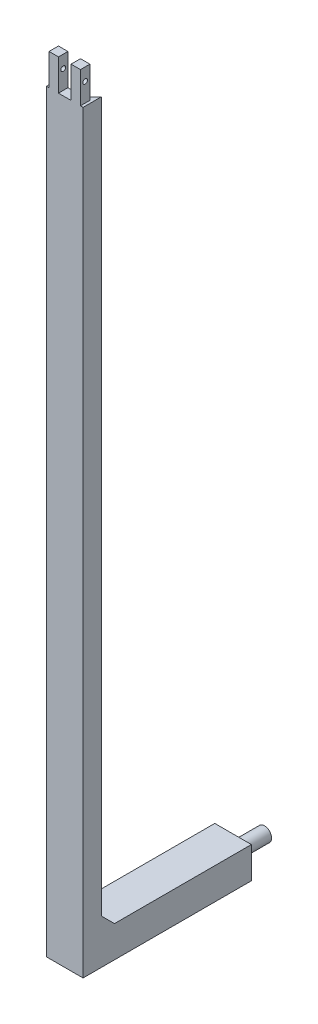
ISO-10303-21;
HEADER;
FILE_DESCRIPTION(('STEP AP214'),'2;1');
FILE_NAME('part.step','',(''),(''),'','','');
FILE_SCHEMA(('AUTOMOTIVE_DESIGN { 1 0 10303 214 1 1 1 1 }'));
ENDSEC;
DATA;
#1=APPLICATION_CONTEXT('core data for automotive mechanical design processes');
#2=APPLICATION_PROTOCOL_DEFINITION('international standard','automotive_design',2000,#1);
#3=PRODUCT_CONTEXT('',#1,'mechanical');
#4=PRODUCT('Part','Part','',(#3));
#5=PRODUCT_RELATED_PRODUCT_CATEGORY('part','',(#4));
#6=PRODUCT_DEFINITION_FORMATION('','',#4);
#7=PRODUCT_DEFINITION_CONTEXT('part definition',#1,'design');
#8=PRODUCT_DEFINITION('design','',#6,#7);
#9=PRODUCT_DEFINITION_SHAPE('','',#8);
#10=(LENGTH_UNIT() NAMED_UNIT(*) SI_UNIT(.MILLI.,.METRE.));
#11=(NAMED_UNIT(*) PLANE_ANGLE_UNIT() SI_UNIT($,.RADIAN.));
#12=(NAMED_UNIT(*) SI_UNIT($,.STERADIAN.) SOLID_ANGLE_UNIT());
#13=UNCERTAINTY_MEASURE_WITH_UNIT(LENGTH_MEASURE(1.E-05),#10,'distance_accuracy_value','');
#14=(GEOMETRIC_REPRESENTATION_CONTEXT(3) GLOBAL_UNCERTAINTY_ASSIGNED_CONTEXT((#13)) GLOBAL_UNIT_ASSIGNED_CONTEXT((#10,
#11,#12)) REPRESENTATION_CONTEXT('',''));
#15=CARTESIAN_POINT('',(0.,0.,0.));
#16=DIRECTION('',(0.,0.,1.));
#17=DIRECTION('',(1.,0.,0.));
#18=AXIS2_PLACEMENT_3D('',#15,#16,#17);
#19=CARTESIAN_POINT('',(0.,0.,0.));
#20=DIRECTION('',(0.,0.,-1.));
#21=DIRECTION('',(-1.,0.,0.));
#22=AXIS2_PLACEMENT_3D('',#19,#20,#21);
#23=PLANE('',#22);
#24=DIRECTION('',(-1.,0.,0.));
#25=VECTOR('',#24,1.);
#26=CARTESIAN_POINT('',(2.82842712474619,-223.,0.));
#27=LINE('',#26,#25);
#28=CARTESIAN_POINT('',(0.,-223.,0.));
#29=VERTEX_POINT('',#28);
#30=CARTESIAN_POINT('',(-5.99999999999997,-223.,0.));
#31=VERTEX_POINT('',#30);
#32=EDGE_CURVE('E64',#29,#31,#27,.T.);
#33=ORIENTED_EDGE('',*,*,#32,.T.);
#34=DIRECTION('',(0.,-1.,0.));
#35=VECTOR('',#34,1.);
#36=CARTESIAN_POINT('',(-6.,0.,0.));
#37=LINE('',#36,#35);
#38=CARTESIAN_POINT('',(-5.99999999999997,0.,0.));
#39=VERTEX_POINT('',#38);
#40=EDGE_CURVE('E341',#39,#31,#37,.T.);
#41=ORIENTED_EDGE('',*,*,#40,.F.);
#42=DIRECTION('',(-1.,0.,0.));
#43=VECTOR('',#42,1.);
#44=CARTESIAN_POINT('',(-7.99999999999998,0.,0.));
#45=LINE('',#44,#43);
#46=CARTESIAN_POINT('',(-7.99999999999998,0.,0.));
#47=VERTEX_POINT('',#46);
#48=EDGE_CURVE('E49',#39,#47,#45,.T.);
#49=ORIENTED_EDGE('',*,*,#48,.T.);
#50=DIRECTION('',(0.,-1.,0.));
#51=VECTOR('',#50,1.);
#52=CARTESIAN_POINT('',(-7.99999999999999,10.,0.));
#53=LINE('',#52,#51);
#54=CARTESIAN_POINT('',(-7.99999999999999,10.,0.));
#55=VERTEX_POINT('',#54);
#56=EDGE_CURVE('E265',#55,#47,#53,.T.);
#57=ORIENTED_EDGE('',*,*,#56,.F.);
#58=DIRECTION('',(-1.,0.,0.));
#59=VECTOR('',#58,1.);
#60=CARTESIAN_POINT('',(-7.99999999999999,10.,0.));
#61=LINE('',#60,#59);
#62=CARTESIAN_POINT('',(-4.99999999999999,10.,0.));
#63=VERTEX_POINT('',#62);
#64=EDGE_CURVE('E262',#63,#55,#61,.T.);
#65=ORIENTED_EDGE('',*,*,#64,.F.);
#66=DIRECTION('',(0.,-1.,0.));
#67=VECTOR('',#66,1.);
#68=CARTESIAN_POINT('',(-4.99999999999999,10.,0.));
#69=LINE('',#68,#67);
#70=CARTESIAN_POINT('',(-4.99999999999998,0.,0.));
#71=VERTEX_POINT('',#70);
#72=EDGE_CURVE('E279',#63,#71,#69,.T.);
#73=ORIENTED_EDGE('',*,*,#72,.T.);
#74=DIRECTION('',(-1.,0.,0.));
#75=VECTOR('',#74,1.);
#76=CARTESIAN_POINT('',(0.,0.,0.));
#77=LINE('',#76,#75);
#78=CARTESIAN_POINT('',(-0.999999999999984,0.,0.));
#79=VERTEX_POINT('',#78);
#80=EDGE_CURVE('E339',#79,#71,#77,.T.);
#81=ORIENTED_EDGE('',*,*,#80,.F.);
#82=DIRECTION('',(0.,-1.,0.));
#83=VECTOR('',#82,1.);
#84=CARTESIAN_POINT('',(-0.999999999999986,10.,0.));
#85=LINE('',#84,#83);
#86=CARTESIAN_POINT('',(-0.999999999999986,10.,0.));
#87=VERTEX_POINT('',#86);
#88=EDGE_CURVE('E242',#87,#79,#85,.T.);
#89=ORIENTED_EDGE('',*,*,#88,.F.);
#90=DIRECTION('',(-1.,0.,0.));
#91=VECTOR('',#90,1.);
#92=CARTESIAN_POINT('',(2.00000000000001,10.,0.));
#93=LINE('',#92,#91);
#94=CARTESIAN_POINT('',(2.00000000000001,10.,0.));
#95=VERTEX_POINT('',#94);
#96=EDGE_CURVE('E214',#95,#87,#93,.T.);
#97=ORIENTED_EDGE('',*,*,#96,.F.);
#98=DIRECTION('',(0.,-1.,0.));
#99=VECTOR('',#98,1.);
#100=CARTESIAN_POINT('',(2.00000000000001,10.,0.));
#101=LINE('',#100,#99);
#102=CARTESIAN_POINT('',(2.00000000000002,0.,0.));
#103=VERTEX_POINT('',#102);
#104=EDGE_CURVE('E246',#95,#103,#101,.T.);
#105=ORIENTED_EDGE('',*,*,#104,.T.);
#106=DIRECTION('',(-1.,0.,0.));
#107=VECTOR('',#106,1.);
#108=CARTESIAN_POINT('',(2.00000000000002,0.,0.));
#109=LINE('',#108,#107);
#110=CARTESIAN_POINT('',(0.,0.,0.));
#111=VERTEX_POINT('',#110);
#112=EDGE_CURVE('E228',#103,#111,#109,.T.);
#113=ORIENTED_EDGE('',*,*,#112,.T.);
#114=DIRECTION('',(0.,1.,0.));
#115=VECTOR('',#114,1.);
#116=CARTESIAN_POINT('',(0.,0.,0.));
#117=LINE('',#116,#115);
#118=EDGE_CURVE('E325',#29,#111,#117,.T.);
#119=ORIENTED_EDGE('',*,*,#118,.F.);
#120=EDGE_LOOP('',(#33,#41,#49,#57,#65,#73,#81,#89,#97,#105,#113,#119));
#121=FACE_BOUND('',#120,.T.);
#122=ADVANCED_FACE('F39',(#121),#23,.T.);
#123=CARTESIAN_POINT('',(0.,0.,0.));
#124=DIRECTION('',(-0.707106781186549,0.,-0.707106781186546));
#125=DIRECTION('',(-0.707106781186546,0.,0.707106781186549));
#126=AXIS2_PLACEMENT_3D('',#123,#124,#125);
#127=PLANE('',#126);
#128=DIRECTION('',(0.577350269189624,-0.577350269189627,-0.577350269189626));
#129=VECTOR('',#128,1.);
#130=CARTESIAN_POINT('',(-74.3333333333333,-148.666666666666,74.3333333333335));
#131=LINE('',#130,#129);
#132=CARTESIAN_POINT('',(2.82842712474619,-225.828427124746,-2.82842712474619));
#133=VERTEX_POINT('',#132);
#134=EDGE_CURVE('E57',#29,#133,#131,.T.);
#135=ORIENTED_EDGE('',*,*,#134,.F.);
#136=ORIENTED_EDGE('',*,*,#118,.T.);
#137=DIRECTION('',(0.707106781186546,0.,-0.707106781186549));
#138=VECTOR('',#137,1.);
#139=CARTESIAN_POINT('',(0.,0.,0.));
#140=LINE('',#139,#138);
#141=CARTESIAN_POINT('',(2.82842712474619,0.,-2.82842712474619));
#142=VERTEX_POINT('',#141);
#143=EDGE_CURVE('E310',#111,#142,#140,.T.);
#144=ORIENTED_EDGE('',*,*,#143,.T.);
#145=DIRECTION('',(0.,-1.,0.));
#146=VECTOR('',#145,1.);
#147=CARTESIAN_POINT('',(2.82842712474619,0.,-2.82842712474619));
#148=LINE('',#147,#146);
#149=EDGE_CURVE('E318',#142,#133,#148,.T.);
#150=ORIENTED_EDGE('',*,*,#149,.T.);
#151=EDGE_LOOP('',(#135,#136,#144,#150));
#152=FACE_BOUND('',#151,.T.);
#153=ADVANCED_FACE('F382',(#152),#127,.T.);
#154=CARTESIAN_POINT('',(-5.99999999999997,0.,0.));
#155=DIRECTION('',(0.707106781186549,0.,-0.707106781186546));
#156=DIRECTION('',(-0.707106781186546,0.,-0.707106781186549));
#157=AXIS2_PLACEMENT_3D('',#154,#155,#156);
#158=PLANE('',#157);
#159=DIRECTION('',(0.577350269189624,0.577350269189627,0.577350269189626));
#160=VECTOR('',#159,1.);
#161=CARTESIAN_POINT('',(68.3333333333333,-148.666666666666,74.3333333333335));
#162=LINE('',#161,#160);
#163=CARTESIAN_POINT('',(-8.82842712474615,-225.828427124746,-2.82842712474619));
#164=VERTEX_POINT('',#163);
#165=EDGE_CURVE('E386',#164,#31,#162,.T.);
#166=ORIENTED_EDGE('',*,*,#165,.F.);
#167=DIRECTION('',(0.,-1.,0.));
#168=VECTOR('',#167,1.);
#169=CARTESIAN_POINT('',(-8.82842712474615,0.,-2.8284271247462));
#170=LINE('',#169,#168);
#171=CARTESIAN_POINT('',(-8.82842712474615,0.,-2.8284271247462));
#172=VERTEX_POINT('',#171);
#173=EDGE_CURVE('E300',#172,#164,#170,.T.);
#174=ORIENTED_EDGE('',*,*,#173,.F.);
#175=DIRECTION('',(0.707106781186546,0.,0.707106781186549));
#176=VECTOR('',#175,1.);
#177=CARTESIAN_POINT('',(-5.99999999999997,0.,0.));
#178=LINE('',#177,#176);
#179=EDGE_CURVE('E296',#172,#39,#178,.T.);
#180=ORIENTED_EDGE('',*,*,#179,.T.);
#181=ORIENTED_EDGE('',*,*,#40,.T.);
#182=EDGE_LOOP('',(#166,#174,#180,#181));
#183=FACE_BOUND('',#182,.T.);
#184=ADVANCED_FACE('F372',(#183),#158,.T.);
#185=CARTESIAN_POINT('',(0.,0.,3.));
#186=DIRECTION('',(0.,-1.,0.));
#187=DIRECTION('',(1.,0.,0.));
#188=AXIS2_PLACEMENT_3D('',#185,#186,#187);
#189=PLANE('',#188);
#190=DIRECTION('',(0.,0.,-1.));
#191=VECTOR('',#190,1.);
#192=CARTESIAN_POINT('',(2.00000000000002,0.,3.));
#193=LINE('',#192,#191);
#194=CARTESIAN_POINT('',(2.00000000000002,0.,3.));
#195=VERTEX_POINT('',#194);
#196=EDGE_CURVE('E209',#195,#103,#193,.T.);
#197=ORIENTED_EDGE('',*,*,#196,.F.);
#198=DIRECTION('',(-1.,0.,0.));
#199=VECTOR('',#198,1.);
#200=CARTESIAN_POINT('',(0.,0.,3.));
#201=LINE('',#200,#199);
#202=CARTESIAN_POINT('',(2.82842712474618,0.,3.));
#203=VERTEX_POINT('',#202);
#204=EDGE_CURVE('E328',#203,#195,#201,.T.);
#205=ORIENTED_EDGE('',*,*,#204,.F.);
#206=DIRECTION('',(0.,0.,1.));
#207=VECTOR('',#206,1.);
#208=CARTESIAN_POINT('',(2.82842712474619,0.,-2.82842712474619));
#209=LINE('',#208,#207);
#210=EDGE_CURVE('E314',#142,#203,#209,.T.);
#211=ORIENTED_EDGE('',*,*,#210,.F.);
#212=ORIENTED_EDGE('',*,*,#143,.F.);
#213=ORIENTED_EDGE('',*,*,#112,.F.);
#214=EDGE_LOOP('',(#197,#205,#211,#212,#213));
#215=FACE_BOUND('',#214,.T.);
#216=ADVANCED_FACE('F381',(#215),#189,.F.);
#217=DIRECTION('',(0.,0.,1.));
#218=VECTOR('',#217,1.);
#219=CARTESIAN_POINT('',(-0.999999999999984,0.,3.));
#220=LINE('',#219,#218);
#221=CARTESIAN_POINT('',(-0.999999999999984,0.,3.));
#222=VERTEX_POINT('',#221);
#223=EDGE_CURVE('E215',#79,#222,#220,.T.);
#224=ORIENTED_EDGE('',*,*,#223,.F.);
#225=ORIENTED_EDGE('',*,*,#80,.T.);
#226=DIRECTION('',(0.,0.,-1.));
#227=VECTOR('',#226,1.);
#228=CARTESIAN_POINT('',(-4.99999999999998,0.,3.));
#229=LINE('',#228,#227);
#230=CARTESIAN_POINT('',(-4.99999999999998,0.,3.));
#231=VERTEX_POINT('',#230);
#232=EDGE_CURVE('E256',#231,#71,#229,.T.);
#233=ORIENTED_EDGE('',*,*,#232,.F.);
#234=EDGE_CURVE('E332',#222,#231,#201,.T.);
#235=ORIENTED_EDGE('',*,*,#234,.F.);
#236=EDGE_LOOP('',(#224,#225,#233,#235));
#237=FACE_BOUND('',#236,.T.);
#238=ADVANCED_FACE('F357',(#237),#189,.F.);
#239=DIRECTION('',(0.,0.,1.));
#240=VECTOR('',#239,1.);
#241=CARTESIAN_POINT('',(-7.99999999999999,0.,3.));
#242=LINE('',#241,#240);
#243=CARTESIAN_POINT('',(-7.99999999999999,0.,3.));
#244=VERTEX_POINT('',#243);
#245=EDGE_CURVE('E250',#47,#244,#242,.T.);
#246=ORIENTED_EDGE('',*,*,#245,.F.);
#247=ORIENTED_EDGE('',*,*,#48,.F.);
#248=ORIENTED_EDGE('',*,*,#179,.F.);
#249=DIRECTION('',(0.,0.,-1.));
#250=VECTOR('',#249,1.);
#251=CARTESIAN_POINT('',(-8.82842712474615,0.,-2.8284271247462));
#252=LINE('',#251,#250);
#253=CARTESIAN_POINT('',(-8.82842712474615,0.,3.));
#254=VERTEX_POINT('',#253);
#255=EDGE_CURVE('E292',#254,#172,#252,.T.);
#256=ORIENTED_EDGE('',*,*,#255,.F.);
#257=EDGE_CURVE('E333',#244,#254,#201,.T.);
#258=ORIENTED_EDGE('',*,*,#257,.F.);
#259=EDGE_LOOP('',(#246,#247,#248,#256,#258));
#260=FACE_BOUND('',#259,.T.);
#261=ADVANCED_FACE('F41',(#260),#189,.F.);
#262=CARTESIAN_POINT('',(0.,-240.,3.));
#263=DIRECTION('',(0.,1.,0.));
#264=DIRECTION('',(0.,0.,1.));
#265=AXIS2_PLACEMENT_3D('',#262,#263,#264);
#266=PLANE('',#265);
#267=DIRECTION('',(0.,0.,-1.));
#268=VECTOR('',#267,1.);
#269=CARTESIAN_POINT('',(-8.82842712474615,-240.,-2.8284271247462));
#270=LINE('',#269,#268);
#271=CARTESIAN_POINT('',(-8.82842712474615,-240.,3.));
#272=VERTEX_POINT('',#271);
#273=CARTESIAN_POINT('',(-8.82842712474615,-240.,-50.58));
#274=VERTEX_POINT('',#273);
#275=EDGE_CURVE('E291',#272,#274,#270,.T.);
#276=ORIENTED_EDGE('',*,*,#275,.T.);
#277=DIRECTION('',(-1.,0.,0.));
#278=VECTOR('',#277,1.);
#279=CARTESIAN_POINT('',(-8.82842712474615,-240.,-50.58));
#280=LINE('',#279,#278);
#281=CARTESIAN_POINT('',(2.82842712474619,-240.,-50.58));
#282=VERTEX_POINT('',#281);
#283=EDGE_CURVE('E180',#282,#274,#280,.T.);
#284=ORIENTED_EDGE('',*,*,#283,.F.);
#285=DIRECTION('',(0.,0.,1.));
#286=VECTOR('',#285,1.);
#287=CARTESIAN_POINT('',(2.82842712474619,-240.,-2.82842712474619));
#288=LINE('',#287,#286);
#289=CARTESIAN_POINT('',(2.82842712474618,-240.,3.));
#290=VERTEX_POINT('',#289);
#291=EDGE_CURVE('E307',#282,#290,#288,.T.);
#292=ORIENTED_EDGE('',*,*,#291,.T.);
#293=DIRECTION('',(1.,0.,0.));
#294=VECTOR('',#293,1.);
#295=CARTESIAN_POINT('',(0.,-240.,3.));
#296=LINE('',#295,#294);
#297=EDGE_CURVE('E275',#272,#290,#296,.T.);
#298=ORIENTED_EDGE('',*,*,#297,.F.);
#299=EDGE_LOOP('',(#276,#284,#292,#298));
#300=FACE_BOUND('',#299,.T.);
#301=ADVANCED_FACE('F405',(#300),#266,.F.);
#302=CARTESIAN_POINT('',(0.,0.,3.));
#303=DIRECTION('',(0.,0.,-1.));
#304=DIRECTION('',(-1.,0.,0.));
#305=AXIS2_PLACEMENT_3D('',#302,#303,#304);
#306=PLANE('',#305);
#307=ORIENTED_EDGE('',*,*,#297,.T.);
#308=DIRECTION('',(0.,-1.,0.));
#309=VECTOR('',#308,1.);
#310=CARTESIAN_POINT('',(2.82842712474618,0.,3.));
#311=LINE('',#310,#309);
#312=EDGE_CURVE('E321',#203,#290,#311,.T.);
#313=ORIENTED_EDGE('',*,*,#312,.F.);
#314=ORIENTED_EDGE('',*,*,#204,.T.);
#315=DIRECTION('',(0.,-1.,0.));
#316=VECTOR('',#315,1.);
#317=CARTESIAN_POINT('',(2.00000000000002,10.,3.));
#318=LINE('',#317,#316);
#319=CARTESIAN_POINT('',(2.00000000000002,10.,3.));
#320=VERTEX_POINT('',#319);
#321=EDGE_CURVE('E224',#320,#195,#318,.T.);
#322=ORIENTED_EDGE('',*,*,#321,.F.);
#323=DIRECTION('',(1.,0.,0.));
#324=VECTOR('',#323,1.);
#325=CARTESIAN_POINT('',(2.00000000000002,10.,3.));
#326=LINE('',#325,#324);
#327=CARTESIAN_POINT('',(-0.999999999999986,10.,3.));
#328=VERTEX_POINT('',#327);
#329=EDGE_CURVE('E221',#328,#320,#326,.T.);
#330=ORIENTED_EDGE('',*,*,#329,.F.);
#331=DIRECTION('',(0.,-1.,0.));
#332=VECTOR('',#331,1.);
#333=CARTESIAN_POINT('',(-0.999999999999986,10.,3.));
#334=LINE('',#333,#332);
#335=EDGE_CURVE('E238',#328,#222,#334,.T.);
#336=ORIENTED_EDGE('',*,*,#335,.T.);
#337=ORIENTED_EDGE('',*,*,#234,.T.);
#338=DIRECTION('',(0.,-1.,0.));
#339=VECTOR('',#338,1.);
#340=CARTESIAN_POINT('',(-4.99999999999999,10.,3.));
#341=LINE('',#340,#339);
#342=CARTESIAN_POINT('',(-4.99999999999999,10.,3.));
#343=VERTEX_POINT('',#342);
#344=EDGE_CURVE('E283',#343,#231,#341,.T.);
#345=ORIENTED_EDGE('',*,*,#344,.F.);
#346=DIRECTION('',(1.,0.,0.));
#347=VECTOR('',#346,1.);
#348=CARTESIAN_POINT('',(-7.99999999999999,10.,3.));
#349=LINE('',#348,#347);
#350=CARTESIAN_POINT('',(-7.99999999999999,10.,3.));
#351=VERTEX_POINT('',#350);
#352=EDGE_CURVE('E255',#351,#343,#349,.T.);
#353=ORIENTED_EDGE('',*,*,#352,.F.);
#354=DIRECTION('',(0.,-1.,0.));
#355=VECTOR('',#354,1.);
#356=CARTESIAN_POINT('',(-7.99999999999999,10.,3.));
#357=LINE('',#356,#355);
#358=EDGE_CURVE('E287',#351,#244,#357,.T.);
#359=ORIENTED_EDGE('',*,*,#358,.T.);
#360=ORIENTED_EDGE('',*,*,#257,.T.);
#361=DIRECTION('',(0.,-1.,0.));
#362=VECTOR('',#361,1.);
#363=CARTESIAN_POINT('',(-8.82842712474615,0.,3.));
#364=LINE('',#363,#362);
#365=EDGE_CURVE('E303',#254,#272,#364,.T.);
#366=ORIENTED_EDGE('',*,*,#365,.T.);
#367=EDGE_LOOP('',(#307,#313,#314,#322,#330,#336,#337,#345,#353,#359,#360,#366));
#368=FACE_BOUND('',#367,.T.);
#369=ADVANCED_FACE('F351',(#368),#306,.F.);
#370=CARTESIAN_POINT('',(2.82842712474619,0.,-2.82842712474619));
#371=DIRECTION('',(1.,0.,0.));
#372=DIRECTION('',(0.,0.,-1.));
#373=AXIS2_PLACEMENT_3D('',#370,#371,#372);
#374=PLANE('',#373);
#375=DIRECTION('',(0.,-0.707106781186548,-0.707106781186547));
#376=VECTOR('',#375,1.);
#377=CARTESIAN_POINT('',(2.82842712474619,-223.,0.));
#378=LINE('',#377,#376);
#379=CARTESIAN_POINT('',(2.82842712474619,-230.,-7.));
#380=VERTEX_POINT('',#379);
#381=EDGE_CURVE('E393',#133,#380,#378,.T.);
#382=ORIENTED_EDGE('',*,*,#381,.F.);
#383=ORIENTED_EDGE('',*,*,#149,.F.);
#384=ORIENTED_EDGE('',*,*,#210,.T.);
#385=ORIENTED_EDGE('',*,*,#312,.T.);
#386=ORIENTED_EDGE('',*,*,#291,.F.);
#387=DIRECTION('',(0.,-1.,0.));
#388=VECTOR('',#387,1.);
#389=CARTESIAN_POINT('',(2.82842712474619,-240.,-50.58));
#390=LINE('',#389,#388);
#391=CARTESIAN_POINT('',(2.82842712474619,-230.,-50.58));
#392=VERTEX_POINT('',#391);
#393=EDGE_CURVE('E173',#392,#282,#390,.T.);
#394=ORIENTED_EDGE('',*,*,#393,.F.);
#395=DIRECTION('',(0.,0.,1.));
#396=VECTOR('',#395,1.);
#397=CARTESIAN_POINT('',(2.82842712474619,-230.,-50.58));
#398=LINE('',#397,#396);
#399=EDGE_CURVE('E168',#392,#380,#398,.T.);
#400=ORIENTED_EDGE('',*,*,#399,.T.);
#401=EDGE_LOOP('',(#382,#383,#384,#385,#386,#394,#400));
#402=FACE_BOUND('',#401,.T.);
#403=ADVANCED_FACE('F377',(#402),#374,.T.);
#404=CARTESIAN_POINT('',(-8.82842712474615,0.,-2.8284271247462));
#405=DIRECTION('',(-1.,0.,0.));
#406=DIRECTION('',(0.,0.,1.));
#407=AXIS2_PLACEMENT_3D('',#404,#405,#406);
#408=PLANE('',#407);
#409=ORIENTED_EDGE('',*,*,#173,.T.);
#410=DIRECTION('',(0.,-0.707106781186548,-0.707106781186547));
#411=VECTOR('',#410,1.);
#412=CARTESIAN_POINT('',(-8.82842712474615,-223.,0.));
#413=LINE('',#412,#411);
#414=CARTESIAN_POINT('',(-8.82842712474615,-230.,-7.));
#415=VERTEX_POINT('',#414);
#416=EDGE_CURVE('E189',#164,#415,#413,.T.);
#417=ORIENTED_EDGE('',*,*,#416,.T.);
#418=DIRECTION('',(0.,0.,1.));
#419=VECTOR('',#418,1.);
#420=CARTESIAN_POINT('',(-8.82842712474615,-230.,-50.58));
#421=LINE('',#420,#419);
#422=CARTESIAN_POINT('',(-8.82842712474615,-230.,-50.58));
#423=VERTEX_POINT('',#422);
#424=EDGE_CURVE('E165',#423,#415,#421,.T.);
#425=ORIENTED_EDGE('',*,*,#424,.F.);
#426=DIRECTION('',(0.,1.,0.));
#427=VECTOR('',#426,1.);
#428=CARTESIAN_POINT('',(-8.82842712474615,-240.,-50.58));
#429=LINE('',#428,#427);
#430=EDGE_CURVE('E174',#274,#423,#429,.T.);
#431=ORIENTED_EDGE('',*,*,#430,.F.);
#432=ORIENTED_EDGE('',*,*,#275,.F.);
#433=ORIENTED_EDGE('',*,*,#365,.F.);
#434=ORIENTED_EDGE('',*,*,#255,.T.);
#435=EDGE_LOOP('',(#409,#417,#425,#431,#432,#433,#434));
#436=FACE_BOUND('',#435,.T.);
#437=ADVANCED_FACE('F187',(#436),#408,.T.);
#438=CARTESIAN_POINT('',(-7.99999999999999,10.,3.));
#439=DIRECTION('',(1.,0.,0.));
#440=DIRECTION('',(0.,0.,-1.));
#441=AXIS2_PLACEMENT_3D('',#438,#439,#440);
#442=PLANE('',#441);
#443=CARTESIAN_POINT('',(-7.99999999999999,6.,1.50000000000001));
#444=DIRECTION('',(1.,0.,0.));
#445=DIRECTION('',(0.,0.,-1.));
#446=AXIS2_PLACEMENT_3D('',#443,#444,#445);
#447=CIRCLE('',#446,0.75);
#448=CARTESIAN_POINT('',(-7.99999999999999,6.,0.750000000000006));
#449=VERTEX_POINT('',#448);
#450=EDGE_CURVE('E205',#449,#449,#447,.T.);
#451=ORIENTED_EDGE('',*,*,#450,.T.);
#452=EDGE_LOOP('',(#451));
#453=FACE_BOUND('',#452,.T.);
#454=ORIENTED_EDGE('',*,*,#245,.T.);
#455=ORIENTED_EDGE('',*,*,#358,.F.);
#456=DIRECTION('',(0.,0.,1.));
#457=VECTOR('',#456,1.);
#458=CARTESIAN_POINT('',(-7.99999999999999,10.,3.));
#459=LINE('',#458,#457);
#460=EDGE_CURVE('E251',#55,#351,#459,.T.);
#461=ORIENTED_EDGE('',*,*,#460,.F.);
#462=ORIENTED_EDGE('',*,*,#56,.T.);
#463=EDGE_LOOP('',(#454,#455,#461,#462));
#464=FACE_BOUND('',#463,.T.);
#465=ADVANCED_FACE('F368',(#453,#464),#442,.F.);
#466=CARTESIAN_POINT('',(-4.99999999999999,10.,3.));
#467=DIRECTION('',(-1.,0.,0.));
#468=DIRECTION('',(0.,-1.,0.));
#469=AXIS2_PLACEMENT_3D('',#466,#467,#468);
#470=PLANE('',#469);
#471=CARTESIAN_POINT('',(-4.99999999999998,6.,1.5));
#472=DIRECTION('',(-1.,0.,0.));
#473=DIRECTION('',(0.,-1.,0.));
#474=AXIS2_PLACEMENT_3D('',#471,#472,#473);
#475=CIRCLE('',#474,0.75);
#476=CARTESIAN_POINT('',(-4.99999999999998,5.25,1.5));
#477=VERTEX_POINT('',#476);
#478=EDGE_CURVE('E201',#477,#477,#475,.T.);
#479=ORIENTED_EDGE('',*,*,#478,.T.);
#480=EDGE_LOOP('',(#479));
#481=FACE_BOUND('',#480,.T.);
#482=ORIENTED_EDGE('',*,*,#232,.T.);
#483=ORIENTED_EDGE('',*,*,#72,.F.);
#484=DIRECTION('',(0.,0.,-1.));
#485=VECTOR('',#484,1.);
#486=CARTESIAN_POINT('',(-4.99999999999999,10.,3.));
#487=LINE('',#486,#485);
#488=EDGE_CURVE('E259',#343,#63,#487,.T.);
#489=ORIENTED_EDGE('',*,*,#488,.F.);
#490=ORIENTED_EDGE('',*,*,#344,.T.);
#491=EDGE_LOOP('',(#482,#483,#489,#490));
#492=FACE_BOUND('',#491,.T.);
#493=ADVANCED_FACE('F360',(#481,#492),#470,.F.);
#494=CARTESIAN_POINT('',(0.,10.,0.));
#495=DIRECTION('',(0.,-1.,0.));
#496=DIRECTION('',(1.,0.,0.));
#497=AXIS2_PLACEMENT_3D('',#494,#495,#496);
#498=PLANE('',#497);
#499=ORIENTED_EDGE('',*,*,#460,.T.);
#500=ORIENTED_EDGE('',*,*,#352,.T.);
#501=ORIENTED_EDGE('',*,*,#488,.T.);
#502=ORIENTED_EDGE('',*,*,#64,.T.);
#503=EDGE_LOOP('',(#499,#500,#501,#502));
#504=FACE_BOUND('',#503,.T.);
#505=ADVANCED_FACE('F363',(#504),#498,.F.);
#506=CARTESIAN_POINT('',(2.00000000000002,10.,3.));
#507=DIRECTION('',(-1.,0.,0.));
#508=DIRECTION('',(0.,0.,1.));
#509=AXIS2_PLACEMENT_3D('',#506,#507,#508);
#510=PLANE('',#509);
#511=CARTESIAN_POINT('',(2.00000000000002,6.,1.5));
#512=DIRECTION('',(1.,0.,0.));
#513=DIRECTION('',(0.,0.,-1.));
#514=AXIS2_PLACEMENT_3D('',#511,#512,#513);
#515=CIRCLE('',#514,0.75);
#516=CARTESIAN_POINT('',(2.00000000000002,6.,0.75));
#517=VERTEX_POINT('',#516);
#518=EDGE_CURVE('E192',#517,#517,#515,.T.);
#519=ORIENTED_EDGE('',*,*,#518,.F.);
#520=EDGE_LOOP('',(#519));
#521=FACE_BOUND('',#520,.T.);
#522=ORIENTED_EDGE('',*,*,#196,.T.);
#523=ORIENTED_EDGE('',*,*,#104,.F.);
#524=DIRECTION('',(0.,0.,-1.));
#525=VECTOR('',#524,1.);
#526=CARTESIAN_POINT('',(2.00000000000002,10.,3.));
#527=LINE('',#526,#525);
#528=EDGE_CURVE('E210',#320,#95,#527,.T.);
#529=ORIENTED_EDGE('',*,*,#528,.F.);
#530=ORIENTED_EDGE('',*,*,#321,.T.);
#531=EDGE_LOOP('',(#522,#523,#529,#530));
#532=FACE_BOUND('',#531,.T.);
#533=ADVANCED_FACE('F436',(#521,#532),#510,.F.);
#534=CARTESIAN_POINT('',(-0.999999999999986,10.,3.));
#535=DIRECTION('',(1.,0.,0.));
#536=DIRECTION('',(0.,1.,0.));
#537=AXIS2_PLACEMENT_3D('',#534,#535,#536);
#538=PLANE('',#537);
#539=CARTESIAN_POINT('',(-0.999999999999987,6.,1.5));
#540=DIRECTION('',(1.,0.,0.));
#541=DIRECTION('',(0.,1.,0.));
#542=AXIS2_PLACEMENT_3D('',#539,#540,#541);
#543=CIRCLE('',#542,0.75);
#544=CARTESIAN_POINT('',(-0.999999999999987,6.75,1.5));
#545=VERTEX_POINT('',#544);
#546=EDGE_CURVE('E43',#545,#545,#543,.T.);
#547=ORIENTED_EDGE('',*,*,#546,.T.);
#548=EDGE_LOOP('',(#547));
#549=FACE_BOUND('',#548,.T.);
#550=ORIENTED_EDGE('',*,*,#223,.T.);
#551=ORIENTED_EDGE('',*,*,#335,.F.);
#552=DIRECTION('',(0.,0.,1.));
#553=VECTOR('',#552,1.);
#554=CARTESIAN_POINT('',(-0.999999999999986,10.,3.));
#555=LINE('',#554,#553);
#556=EDGE_CURVE('E218',#87,#328,#555,.T.);
#557=ORIENTED_EDGE('',*,*,#556,.F.);
#558=ORIENTED_EDGE('',*,*,#88,.T.);
#559=EDGE_LOOP('',(#550,#551,#557,#558));
#560=FACE_BOUND('',#559,.T.);
#561=ADVANCED_FACE('F439',(#549,#560),#538,.F.);
#562=CARTESIAN_POINT('',(0.,10.,0.));
#563=DIRECTION('',(0.,1.,0.));
#564=DIRECTION('',(-1.,0.,0.));
#565=AXIS2_PLACEMENT_3D('',#562,#563,#564);
#566=PLANE('',#565);
#567=ORIENTED_EDGE('',*,*,#528,.T.);
#568=ORIENTED_EDGE('',*,*,#96,.T.);
#569=ORIENTED_EDGE('',*,*,#556,.T.);
#570=ORIENTED_EDGE('',*,*,#329,.T.);
#571=EDGE_LOOP('',(#567,#568,#569,#570));
#572=FACE_BOUND('',#571,.T.);
#573=ADVANCED_FACE('F443',(#572),#566,.T.);
#574=CARTESIAN_POINT('',(-38.,5.99999999999999,1.50000000000002));
#575=DIRECTION('',(1.,0.,0.));
#576=DIRECTION('',(0.,0.,-1.));
#577=AXIS2_PLACEMENT_3D('',#574,#575,#576);
#578=CYLINDRICAL_SURFACE('',#577,0.75);
#579=ORIENTED_EDGE('',*,*,#518,.T.);
#580=EDGE_LOOP('',(#579));
#581=FACE_BOUND('',#580,.T.);
#582=ORIENTED_EDGE('',*,*,#546,.F.);
#583=EDGE_LOOP('',(#582));
#584=FACE_BOUND('',#583,.T.);
#585=ADVANCED_FACE('F447',(#581,#584),#578,.F.);
#586=ORIENTED_EDGE('',*,*,#478,.F.);
#587=EDGE_LOOP('',(#586));
#588=FACE_BOUND('',#587,.T.);
#589=ORIENTED_EDGE('',*,*,#450,.F.);
#590=EDGE_LOOP('',(#589));
#591=FACE_BOUND('',#590,.T.);
#592=ADVANCED_FACE('F449',(#588,#591),#578,.F.);
#593=CARTESIAN_POINT('',(-8.82842712474615,-230.,-50.58));
#594=DIRECTION('',(0.,-1.,0.));
#595=DIRECTION('',(0.,0.,-1.));
#596=AXIS2_PLACEMENT_3D('',#593,#594,#595);
#597=PLANE('',#596);
#598=ORIENTED_EDGE('',*,*,#424,.T.);
#599=DIRECTION('',(-1.,0.,0.));
#600=VECTOR('',#599,1.);
#601=CARTESIAN_POINT('',(2.82842712474619,-230.,-7.));
#602=LINE('',#601,#600);
#603=EDGE_CURVE('E388',#380,#415,#602,.T.);
#604=ORIENTED_EDGE('',*,*,#603,.F.);
#605=ORIENTED_EDGE('',*,*,#399,.F.);
#606=DIRECTION('',(1.,0.,0.));
#607=VECTOR('',#606,1.);
#608=CARTESIAN_POINT('',(-8.82842712474615,-230.,-50.58));
#609=LINE('',#608,#607);
#610=EDGE_CURVE('E161',#423,#392,#609,.T.);
#611=ORIENTED_EDGE('',*,*,#610,.F.);
#612=EDGE_LOOP('',(#598,#604,#605,#611));
#613=FACE_BOUND('',#612,.T.);
#614=ADVANCED_FACE('F163',(#613),#597,.F.);
#615=CARTESIAN_POINT('',(0.,0.,-50.58));
#616=DIRECTION('',(0.,0.,-1.));
#617=DIRECTION('',(-1.,0.,0.));
#618=AXIS2_PLACEMENT_3D('',#615,#616,#617);
#619=PLANE('',#618);
#620=CARTESIAN_POINT('',(-2.99999999999999,-235.,-50.58));
#621=DIRECTION('',(0.,0.,-1.));
#622=DIRECTION('',(-1.,0.,0.));
#623=AXIS2_PLACEMENT_3D('',#620,#621,#622);
#624=CIRCLE('',#623,2.25);
#625=CARTESIAN_POINT('',(-5.24999999999999,-235.,-50.58));
#626=VERTEX_POINT('',#625);
#627=EDGE_CURVE('E11',#626,#626,#624,.T.);
#628=ORIENTED_EDGE('',*,*,#627,.F.);
#629=EDGE_LOOP('',(#628));
#630=FACE_BOUND('',#629,.T.);
#631=ORIENTED_EDGE('',*,*,#430,.T.);
#632=ORIENTED_EDGE('',*,*,#610,.T.);
#633=ORIENTED_EDGE('',*,*,#393,.T.);
#634=ORIENTED_EDGE('',*,*,#283,.T.);
#635=EDGE_LOOP('',(#631,#632,#633,#634));
#636=FACE_BOUND('',#635,.T.);
#637=ADVANCED_FACE('F178',(#630,#636),#619,.T.);
#638=CARTESIAN_POINT('',(-2.99999999999999,-235.,-60.58));
#639=DIRECTION('',(0.,0.,1.));
#640=DIRECTION('',(1.,0.,0.));
#641=AXIS2_PLACEMENT_3D('',#638,#639,#640);
#642=CYLINDRICAL_SURFACE('',#641,2.25);
#643=CARTESIAN_POINT('',(-2.99999999999999,-235.,-60.58));
#644=DIRECTION('',(0.,0.,-1.));
#645=DIRECTION('',(-1.,0.,0.));
#646=AXIS2_PLACEMENT_3D('',#643,#644,#645);
#647=CIRCLE('',#646,2.25);
#648=CARTESIAN_POINT('',(-5.24999999999999,-235.,-60.58));
#649=VERTEX_POINT('',#648);
#650=EDGE_CURVE('E184',#649,#649,#647,.T.);
#651=ORIENTED_EDGE('',*,*,#650,.F.);
#652=EDGE_LOOP('',(#651));
#653=FACE_BOUND('',#652,.T.);
#654=ORIENTED_EDGE('',*,*,#627,.T.);
#655=EDGE_LOOP('',(#654));
#656=FACE_BOUND('',#655,.T.);
#657=ADVANCED_FACE('F457',(#653,#656),#642,.T.);
#658=CARTESIAN_POINT('',(-2.99999999999999,-235.,-60.58));
#659=DIRECTION('',(0.,0.,-1.));
#660=DIRECTION('',(-1.,0.,0.));
#661=AXIS2_PLACEMENT_3D('',#658,#659,#660);
#662=PLANE('',#661);
#663=ORIENTED_EDGE('',*,*,#650,.T.);
#664=EDGE_LOOP('',(#663));
#665=FACE_BOUND('',#664,.T.);
#666=ADVANCED_FACE('F461',(#665),#662,.T.);
#667=CARTESIAN_POINT('',(2.82842712474619,-223.,0.));
#668=DIRECTION('',(0.,0.707106781186547,-0.707106781186548));
#669=DIRECTION('',(0.,0.707106781186548,0.707106781186547));
#670=AXIS2_PLACEMENT_3D('',#667,#668,#669);
#671=PLANE('',#670);
#672=ORIENTED_EDGE('',*,*,#32,.F.);
#673=ORIENTED_EDGE('',*,*,#134,.T.);
#674=ORIENTED_EDGE('',*,*,#381,.T.);
#675=ORIENTED_EDGE('',*,*,#603,.T.);
#676=ORIENTED_EDGE('',*,*,#416,.F.);
#677=ORIENTED_EDGE('',*,*,#165,.T.);
#678=EDGE_LOOP('',(#672,#673,#674,#675,#676,#677));
#679=FACE_BOUND('',#678,.T.);
#680=ADVANCED_FACE('F384',(#679),#671,.T.);
#681=CLOSED_SHELL('',(#122,#153,#184,#216,#238,#261,#301,#369,#403,#437,#465,#493,#505,#533,
#561,#573,#585,#592,#614,#637,#657,#666,#680));
#682=MANIFOLD_SOLID_BREP('B2',#681);
#683=ADVANCED_BREP_SHAPE_REPRESENTATION('',(#18,#682),#14);
#684=SHAPE_DEFINITION_REPRESENTATION(#9,#683);
ENDSEC;
END-ISO-10303-21;
